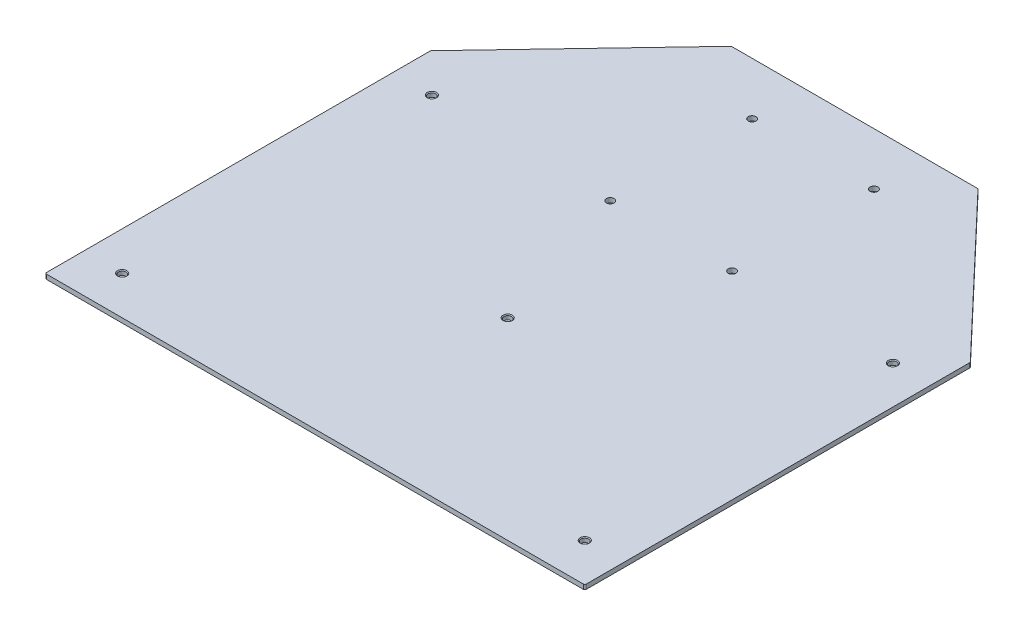
ISO-10303-21;
HEADER;
FILE_DESCRIPTION(('STEP AP214'),'2;1');
FILE_NAME('part.step','',(''),(''),'','','');
FILE_SCHEMA(('AUTOMOTIVE_DESIGN { 1 0 10303 214 1 1 1 1 }'));
ENDSEC;
DATA;
#1=APPLICATION_CONTEXT('core data for automotive mechanical design processes');
#2=APPLICATION_PROTOCOL_DEFINITION('international standard','automotive_design',2000,#1);
#3=PRODUCT_CONTEXT('',#1,'mechanical');
#4=PRODUCT('Part','Part','',(#3));
#5=PRODUCT_RELATED_PRODUCT_CATEGORY('part','',(#4));
#6=PRODUCT_DEFINITION_FORMATION('','',#4);
#7=PRODUCT_DEFINITION_CONTEXT('part definition',#1,'design');
#8=PRODUCT_DEFINITION('design','',#6,#7);
#9=PRODUCT_DEFINITION_SHAPE('','',#8);
#10=(LENGTH_UNIT() NAMED_UNIT(*) SI_UNIT(.MILLI.,.METRE.));
#11=(NAMED_UNIT(*) PLANE_ANGLE_UNIT() SI_UNIT($,.RADIAN.));
#12=(NAMED_UNIT(*) SI_UNIT($,.STERADIAN.) SOLID_ANGLE_UNIT());
#13=UNCERTAINTY_MEASURE_WITH_UNIT(LENGTH_MEASURE(1.E-05),#10,'distance_accuracy_value','');
#14=(GEOMETRIC_REPRESENTATION_CONTEXT(3) GLOBAL_UNCERTAINTY_ASSIGNED_CONTEXT((#13)) GLOBAL_UNIT_ASSIGNED_CONTEXT((#10,
#11,#12)) REPRESENTATION_CONTEXT('',''));
#15=CARTESIAN_POINT('',(0.,0.,0.));
#16=DIRECTION('',(0.,0.,1.));
#17=DIRECTION('',(1.,0.,0.));
#18=AXIS2_PLACEMENT_3D('',#15,#16,#17);
#19=CARTESIAN_POINT('',(-174.,3.,-124.600736952658));
#20=DIRECTION('',(0.,-1.,0.));
#21=DIRECTION('',(0.,0.,-1.));
#22=AXIS2_PLACEMENT_3D('',#19,#20,#21);
#23=CYLINDRICAL_SURFACE('',#22,0.999999999999998);
#24=CARTESIAN_POINT('',(-174.,0.,-124.600736952658));
#25=DIRECTION('',(0.,1.,0.));
#26=DIRECTION('',(0.,0.,1.));
#27=AXIS2_PLACEMENT_3D('',#24,#25,#26);
#28=CIRCLE('',#27,0.999999999999998);
#29=CARTESIAN_POINT('',(-174.725013849983,0.,-125.289471239109));
#30=VERTEX_POINT('',#29);
#31=CARTESIAN_POINT('',(-175.,0.,-124.600736952658));
#32=VERTEX_POINT('',#31);
#33=EDGE_CURVE('E168',#30,#32,#28,.T.);
#34=ORIENTED_EDGE('',*,*,#33,.T.);
#35=DIRECTION('',(0.,-1.,0.));
#36=VECTOR('',#35,1.);
#37=CARTESIAN_POINT('',(-175.,3.,-124.600736952658));
#38=LINE('',#37,#36);
#39=CARTESIAN_POINT('',(-175.,3.,-124.600736952658));
#40=VERTEX_POINT('',#39);
#41=EDGE_CURVE('E11',#40,#32,#38,.T.);
#42=ORIENTED_EDGE('',*,*,#41,.F.);
#43=CARTESIAN_POINT('',(-174.,3.,-124.600736952658));
#44=DIRECTION('',(0.,1.,0.));
#45=DIRECTION('',(0.,0.,1.));
#46=AXIS2_PLACEMENT_3D('',#43,#44,#45);
#47=CIRCLE('',#46,0.999999999999998);
#48=CARTESIAN_POINT('',(-174.725013849983,3.,-125.289471239109));
#49=VERTEX_POINT('',#48);
#50=EDGE_CURVE('E199',#49,#40,#47,.T.);
#51=ORIENTED_EDGE('',*,*,#50,.F.);
#52=DIRECTION('',(0.,-1.,0.));
#53=VECTOR('',#52,1.);
#54=CARTESIAN_POINT('',(-174.725013849983,3.,-125.289471239109));
#55=LINE('',#54,#53);
#56=EDGE_CURVE('E61',#49,#30,#55,.T.);
#57=ORIENTED_EDGE('',*,*,#56,.T.);
#58=EDGE_LOOP('',(#34,#42,#51,#57));
#59=FACE_BOUND('',#58,.T.);
#60=ADVANCED_FACE('F43',(#59),#23,.T.);
#61=CARTESIAN_POINT('',(-175.,3.,-124.600736952658));
#62=DIRECTION('',(1.,0.,0.));
#63=DIRECTION('',(0.,0.,-1.));
#64=AXIS2_PLACEMENT_3D('',#61,#62,#63);
#65=PLANE('',#64);
#66=DIRECTION('',(0.,0.,1.));
#67=VECTOR('',#66,1.);
#68=CARTESIAN_POINT('',(-175.,0.,-124.600736952658));
#69=LINE('',#68,#67);
#70=CARTESIAN_POINT('',(-175.,0.,124.));
#71=VERTEX_POINT('',#70);
#72=EDGE_CURVE('E170',#32,#71,#69,.T.);
#73=ORIENTED_EDGE('',*,*,#72,.T.);
#74=DIRECTION('',(0.,-1.,0.));
#75=VECTOR('',#74,1.);
#76=CARTESIAN_POINT('',(-175.,3.,124.));
#77=LINE('',#76,#75);
#78=CARTESIAN_POINT('',(-175.,3.,124.));
#79=VERTEX_POINT('',#78);
#80=EDGE_CURVE('E52',#79,#71,#77,.T.);
#81=ORIENTED_EDGE('',*,*,#80,.F.);
#82=DIRECTION('',(0.,0.,1.));
#83=VECTOR('',#82,1.);
#84=CARTESIAN_POINT('',(-175.,3.,-124.600736952658));
#85=LINE('',#84,#83);
#86=EDGE_CURVE('E112',#40,#79,#85,.T.);
#87=ORIENTED_EDGE('',*,*,#86,.F.);
#88=ORIENTED_EDGE('',*,*,#41,.T.);
#89=EDGE_LOOP('',(#73,#81,#87,#88));
#90=FACE_BOUND('',#89,.T.);
#91=ADVANCED_FACE('F332',(#90),#65,.F.);
#92=CARTESIAN_POINT('',(-174.,3.,124.));
#93=DIRECTION('',(0.,-1.,0.));
#94=DIRECTION('',(0.,0.,-1.));
#95=AXIS2_PLACEMENT_3D('',#92,#93,#94);
#96=CYLINDRICAL_SURFACE('',#95,1.);
#97=CARTESIAN_POINT('',(-174.,0.,124.));
#98=DIRECTION('',(0.,1.,0.));
#99=DIRECTION('',(0.,0.,1.));
#100=AXIS2_PLACEMENT_3D('',#97,#98,#99);
#101=CIRCLE('',#100,1.);
#102=CARTESIAN_POINT('',(-174.,0.,125.));
#103=VERTEX_POINT('',#102);
#104=EDGE_CURVE('E173',#71,#103,#101,.T.);
#105=ORIENTED_EDGE('',*,*,#104,.T.);
#106=DIRECTION('',(0.,-1.,0.));
#107=VECTOR('',#106,1.);
#108=CARTESIAN_POINT('',(-174.,3.,125.));
#109=LINE('',#108,#107);
#110=CARTESIAN_POINT('',(-174.,3.,125.));
#111=VERTEX_POINT('',#110);
#112=EDGE_CURVE('E213',#111,#103,#109,.T.);
#113=ORIENTED_EDGE('',*,*,#112,.F.);
#114=CARTESIAN_POINT('',(-174.,3.,124.));
#115=DIRECTION('',(0.,1.,0.));
#116=DIRECTION('',(0.,0.,1.));
#117=AXIS2_PLACEMENT_3D('',#114,#115,#116);
#118=CIRCLE('',#117,1.);
#119=EDGE_CURVE('E295',#79,#111,#118,.T.);
#120=ORIENTED_EDGE('',*,*,#119,.F.);
#121=ORIENTED_EDGE('',*,*,#80,.T.);
#122=EDGE_LOOP('',(#105,#113,#120,#121));
#123=FACE_BOUND('',#122,.T.);
#124=ADVANCED_FACE('F336',(#123),#96,.T.);
#125=CARTESIAN_POINT('',(-174.,3.,125.));
#126=DIRECTION('',(0.,0.,-1.));
#127=DIRECTION('',(-1.,0.,0.));
#128=AXIS2_PLACEMENT_3D('',#125,#126,#127);
#129=PLANE('',#128);
#130=DIRECTION('',(1.,0.,0.));
#131=VECTOR('',#130,1.);
#132=CARTESIAN_POINT('',(-174.,0.,125.));
#133=LINE('',#132,#131);
#134=CARTESIAN_POINT('',(174.,0.,125.));
#135=VERTEX_POINT('',#134);
#136=EDGE_CURVE('E175',#103,#135,#133,.T.);
#137=ORIENTED_EDGE('',*,*,#136,.T.);
#138=DIRECTION('',(0.,-1.,0.));
#139=VECTOR('',#138,1.);
#140=CARTESIAN_POINT('',(174.,3.,125.));
#141=LINE('',#140,#139);
#142=CARTESIAN_POINT('',(174.,3.,125.));
#143=VERTEX_POINT('',#142);
#144=EDGE_CURVE('E211',#143,#135,#141,.T.);
#145=ORIENTED_EDGE('',*,*,#144,.F.);
#146=DIRECTION('',(1.,0.,0.));
#147=VECTOR('',#146,1.);
#148=CARTESIAN_POINT('',(-174.,3.,125.));
#149=LINE('',#148,#147);
#150=EDGE_CURVE('E297',#111,#143,#149,.T.);
#151=ORIENTED_EDGE('',*,*,#150,.F.);
#152=ORIENTED_EDGE('',*,*,#112,.T.);
#153=EDGE_LOOP('',(#137,#145,#151,#152));
#154=FACE_BOUND('',#153,.T.);
#155=ADVANCED_FACE('F346',(#154),#129,.F.);
#156=CARTESIAN_POINT('',(174.,3.,124.));
#157=DIRECTION('',(0.,-1.,0.));
#158=DIRECTION('',(0.,0.,-1.));
#159=AXIS2_PLACEMENT_3D('',#156,#157,#158);
#160=CYLINDRICAL_SURFACE('',#159,1.);
#161=CARTESIAN_POINT('',(174.,0.,124.));
#162=DIRECTION('',(0.,-1.,0.));
#163=DIRECTION('',(0.,0.,-1.));
#164=AXIS2_PLACEMENT_3D('',#161,#162,#163);
#165=CIRCLE('',#164,1.);
#166=CARTESIAN_POINT('',(175.,0.,124.));
#167=VERTEX_POINT('',#166);
#168=EDGE_CURVE('E178',#167,#135,#165,.T.);
#169=ORIENTED_EDGE('',*,*,#168,.F.);
#170=DIRECTION('',(0.,-1.,0.));
#171=VECTOR('',#170,1.);
#172=CARTESIAN_POINT('',(175.,3.,124.));
#173=LINE('',#172,#171);
#174=CARTESIAN_POINT('',(175.,3.,124.));
#175=VERTEX_POINT('',#174);
#176=EDGE_CURVE('E209',#175,#167,#173,.T.);
#177=ORIENTED_EDGE('',*,*,#176,.F.);
#178=CARTESIAN_POINT('',(174.,3.,124.));
#179=DIRECTION('',(0.,-1.,0.));
#180=DIRECTION('',(0.,0.,-1.));
#181=AXIS2_PLACEMENT_3D('',#178,#179,#180);
#182=CIRCLE('',#181,1.);
#183=EDGE_CURVE('E299',#175,#143,#182,.T.);
#184=ORIENTED_EDGE('',*,*,#183,.T.);
#185=ORIENTED_EDGE('',*,*,#144,.T.);
#186=EDGE_LOOP('',(#169,#177,#184,#185));
#187=FACE_BOUND('',#186,.T.);
#188=ADVANCED_FACE('F362',(#187),#160,.T.);
#189=CARTESIAN_POINT('',(175.,3.,-124.600736952658));
#190=DIRECTION('',(1.,0.,0.));
#191=DIRECTION('',(0.,0.,-1.));
#192=AXIS2_PLACEMENT_3D('',#189,#190,#191);
#193=PLANE('',#192);
#194=DIRECTION('',(0.,0.,1.));
#195=VECTOR('',#194,1.);
#196=CARTESIAN_POINT('',(175.,0.,-124.600736952658));
#197=LINE('',#196,#195);
#198=CARTESIAN_POINT('',(175.,0.,-124.600736952658));
#199=VERTEX_POINT('',#198);
#200=EDGE_CURVE('E181',#199,#167,#197,.T.);
#201=ORIENTED_EDGE('',*,*,#200,.F.);
#202=DIRECTION('',(0.,-1.,0.));
#203=VECTOR('',#202,1.);
#204=CARTESIAN_POINT('',(175.,3.,-124.600736952658));
#205=LINE('',#204,#203);
#206=CARTESIAN_POINT('',(175.,3.,-124.600736952658));
#207=VERTEX_POINT('',#206);
#208=EDGE_CURVE('E207',#207,#199,#205,.T.);
#209=ORIENTED_EDGE('',*,*,#208,.F.);
#210=DIRECTION('',(0.,0.,1.));
#211=VECTOR('',#210,1.);
#212=CARTESIAN_POINT('',(175.,3.,-124.600736952658));
#213=LINE('',#212,#211);
#214=EDGE_CURVE('E302',#207,#175,#213,.T.);
#215=ORIENTED_EDGE('',*,*,#214,.T.);
#216=ORIENTED_EDGE('',*,*,#176,.T.);
#217=EDGE_LOOP('',(#201,#209,#215,#216));
#218=FACE_BOUND('',#217,.T.);
#219=ADVANCED_FACE('F352',(#218),#193,.T.);
#220=CARTESIAN_POINT('',(174.,3.,-124.600736952658));
#221=DIRECTION('',(0.,-1.,0.));
#222=DIRECTION('',(0.,0.,-1.));
#223=AXIS2_PLACEMENT_3D('',#220,#221,#222);
#224=CYLINDRICAL_SURFACE('',#223,0.999999999999998);
#225=CARTESIAN_POINT('',(174.,0.,-124.600736952658));
#226=DIRECTION('',(0.,-1.,0.));
#227=DIRECTION('',(0.,0.,-1.));
#228=AXIS2_PLACEMENT_3D('',#225,#226,#227);
#229=CIRCLE('',#228,0.999999999999998);
#230=CARTESIAN_POINT('',(174.725013849983,0.,-125.289471239109));
#231=VERTEX_POINT('',#230);
#232=EDGE_CURVE('E184',#231,#199,#229,.T.);
#233=ORIENTED_EDGE('',*,*,#232,.F.);
#234=DIRECTION('',(0.,-1.,0.));
#235=VECTOR('',#234,1.);
#236=CARTESIAN_POINT('',(174.725013849983,3.,-125.289471239109));
#237=LINE('',#236,#235);
#238=CARTESIAN_POINT('',(174.725013849983,3.,-125.289471239109));
#239=VERTEX_POINT('',#238);
#240=EDGE_CURVE('E205',#239,#231,#237,.T.);
#241=ORIENTED_EDGE('',*,*,#240,.F.);
#242=CARTESIAN_POINT('',(174.,3.,-124.600736952658));
#243=DIRECTION('',(0.,-1.,0.));
#244=DIRECTION('',(0.,0.,-1.));
#245=AXIS2_PLACEMENT_3D('',#242,#243,#244);
#246=CIRCLE('',#245,0.999999999999998);
#247=EDGE_CURVE('E305',#239,#207,#246,.T.);
#248=ORIENTED_EDGE('',*,*,#247,.T.);
#249=ORIENTED_EDGE('',*,*,#208,.T.);
#250=EDGE_LOOP('',(#233,#241,#248,#249));
#251=FACE_BOUND('',#250,.T.);
#252=ADVANCED_FACE('F354',(#251),#224,.T.);
#253=CARTESIAN_POINT('',(80.2956900328497,3.,-224.692926183626));
#254=DIRECTION('',(0.725013849983001,0.,-0.688734286450752));
#255=DIRECTION('',(-0.688734286450752,0.,-0.725013849983001));
#256=AXIS2_PLACEMENT_3D('',#253,#254,#255);
#257=PLANE('',#256);
#258=DIRECTION('',(0.688734286450752,0.,0.725013849983001));
#259=VECTOR('',#258,1.);
#260=CARTESIAN_POINT('',(80.2956900328497,0.,-224.692926183626));
#261=LINE('',#260,#259);
#262=CARTESIAN_POINT('',(80.2956900328497,0.,-224.692926183626));
#263=VERTEX_POINT('',#262);
#264=EDGE_CURVE('E187',#263,#231,#261,.T.);
#265=ORIENTED_EDGE('',*,*,#264,.F.);
#266=DIRECTION('',(0.,-1.,0.));
#267=VECTOR('',#266,1.);
#268=CARTESIAN_POINT('',(80.2956900328497,3.,-224.692926183626));
#269=LINE('',#268,#267);
#270=CARTESIAN_POINT('',(80.2956900328497,3.,-224.692926183626));
#271=VERTEX_POINT('',#270);
#272=EDGE_CURVE('E203',#271,#263,#269,.T.);
#273=ORIENTED_EDGE('',*,*,#272,.F.);
#274=DIRECTION('',(0.688734286450752,0.,0.725013849983001));
#275=VECTOR('',#274,1.);
#276=CARTESIAN_POINT('',(80.2956900328497,3.,-224.692926183626));
#277=LINE('',#276,#275);
#278=EDGE_CURVE('E163',#271,#239,#277,.T.);
#279=ORIENTED_EDGE('',*,*,#278,.T.);
#280=ORIENTED_EDGE('',*,*,#240,.T.);
#281=EDGE_LOOP('',(#265,#273,#279,#280));
#282=FACE_BOUND('',#281,.T.);
#283=ADVANCED_FACE('F310',(#282),#257,.T.);
#284=CARTESIAN_POINT('',(79.5706761828666,3.,-224.004191897175));
#285=DIRECTION('',(0.,-1.,0.));
#286=DIRECTION('',(0.,0.,-1.));
#287=AXIS2_PLACEMENT_3D('',#284,#285,#286);
#288=CYLINDRICAL_SURFACE('',#287,1.);
#289=CARTESIAN_POINT('',(79.5706761828666,0.,-224.004191897175));
#290=DIRECTION('',(0.,-1.,0.));
#291=DIRECTION('',(0.,0.,-1.));
#292=AXIS2_PLACEMENT_3D('',#289,#290,#291);
#293=CIRCLE('',#292,1.);
#294=CARTESIAN_POINT('',(79.5706761828666,0.,-225.004191897175));
#295=VERTEX_POINT('',#294);
#296=EDGE_CURVE('E190',#295,#263,#293,.T.);
#297=ORIENTED_EDGE('',*,*,#296,.F.);
#298=DIRECTION('',(0.,-1.,0.));
#299=VECTOR('',#298,1.);
#300=CARTESIAN_POINT('',(79.5706761828666,3.,-225.004191897175));
#301=LINE('',#300,#299);
#302=CARTESIAN_POINT('',(79.5706761828666,3.,-225.004191897175));
#303=VERTEX_POINT('',#302);
#304=EDGE_CURVE('E149',#303,#295,#301,.T.);
#305=ORIENTED_EDGE('',*,*,#304,.F.);
#306=CARTESIAN_POINT('',(79.5706761828666,3.,-224.004191897175));
#307=DIRECTION('',(0.,-1.,0.));
#308=DIRECTION('',(0.,0.,-1.));
#309=AXIS2_PLACEMENT_3D('',#306,#307,#308);
#310=CIRCLE('',#309,1.);
#311=EDGE_CURVE('E161',#303,#271,#310,.T.);
#312=ORIENTED_EDGE('',*,*,#311,.T.);
#313=ORIENTED_EDGE('',*,*,#272,.T.);
#314=EDGE_LOOP('',(#297,#305,#312,#313));
#315=FACE_BOUND('',#314,.T.);
#316=ADVANCED_FACE('F316',(#315),#288,.T.);
#317=CARTESIAN_POINT('',(-79.5706761828666,3.,-225.004191897175));
#318=DIRECTION('',(0.,0.,-1.));
#319=DIRECTION('',(-1.,0.,0.));
#320=AXIS2_PLACEMENT_3D('',#317,#318,#319);
#321=PLANE('',#320);
#322=DIRECTION('',(1.,0.,0.));
#323=VECTOR('',#322,1.);
#324=CARTESIAN_POINT('',(-79.5706761828666,0.,-225.004191897175));
#325=LINE('',#324,#323);
#326=CARTESIAN_POINT('',(-79.5706761828666,0.,-225.004191897175));
#327=VERTEX_POINT('',#326);
#328=EDGE_CURVE('E146',#327,#295,#325,.T.);
#329=ORIENTED_EDGE('',*,*,#328,.F.);
#330=DIRECTION('',(0.,-1.,0.));
#331=VECTOR('',#330,1.);
#332=CARTESIAN_POINT('',(-79.5706761828666,3.,-225.004191897175));
#333=LINE('',#332,#331);
#334=CARTESIAN_POINT('',(-79.5706761828666,3.,-225.004191897175));
#335=VERTEX_POINT('',#334);
#336=EDGE_CURVE('E140',#335,#327,#333,.T.);
#337=ORIENTED_EDGE('',*,*,#336,.F.);
#338=DIRECTION('',(1.,0.,0.));
#339=VECTOR('',#338,1.);
#340=CARTESIAN_POINT('',(-79.5706761828666,3.,-225.004191897175));
#341=LINE('',#340,#339);
#342=EDGE_CURVE('E144',#335,#303,#341,.T.);
#343=ORIENTED_EDGE('',*,*,#342,.T.);
#344=ORIENTED_EDGE('',*,*,#304,.T.);
#345=EDGE_LOOP('',(#329,#337,#343,#344));
#346=FACE_BOUND('',#345,.T.);
#347=ADVANCED_FACE('F142',(#346),#321,.T.);
#348=CARTESIAN_POINT('',(-79.5706761828666,3.,-224.004191897175));
#349=DIRECTION('',(0.,-1.,0.));
#350=DIRECTION('',(0.,0.,-1.));
#351=AXIS2_PLACEMENT_3D('',#348,#349,#350);
#352=CYLINDRICAL_SURFACE('',#351,1.);
#353=CARTESIAN_POINT('',(-79.5706761828666,0.,-224.004191897175));
#354=DIRECTION('',(0.,1.,0.));
#355=DIRECTION('',(0.,0.,1.));
#356=AXIS2_PLACEMENT_3D('',#353,#354,#355);
#357=CIRCLE('',#356,1.);
#358=CARTESIAN_POINT('',(-80.2956900328497,0.,-224.692926183626));
#359=VERTEX_POINT('',#358);
#360=EDGE_CURVE('E194',#327,#359,#357,.T.);
#361=ORIENTED_EDGE('',*,*,#360,.T.);
#362=DIRECTION('',(0.,-1.,0.));
#363=VECTOR('',#362,1.);
#364=CARTESIAN_POINT('',(-80.2956900328497,3.,-224.692926183626));
#365=LINE('',#364,#363);
#366=CARTESIAN_POINT('',(-80.2956900328497,3.,-224.692926183626));
#367=VERTEX_POINT('',#366);
#368=EDGE_CURVE('E100',#367,#359,#365,.T.);
#369=ORIENTED_EDGE('',*,*,#368,.F.);
#370=CARTESIAN_POINT('',(-79.5706761828666,3.,-224.004191897175));
#371=DIRECTION('',(0.,1.,0.));
#372=DIRECTION('',(0.,0.,1.));
#373=AXIS2_PLACEMENT_3D('',#370,#371,#372);
#374=CIRCLE('',#373,1.);
#375=EDGE_CURVE('E151',#335,#367,#374,.T.);
#376=ORIENTED_EDGE('',*,*,#375,.F.);
#377=ORIENTED_EDGE('',*,*,#336,.T.);
#378=EDGE_LOOP('',(#361,#369,#376,#377));
#379=FACE_BOUND('',#378,.T.);
#380=ADVANCED_FACE('F152',(#379),#352,.T.);
#381=CARTESIAN_POINT('',(-174.725013849983,3.,-125.289471239109));
#382=DIRECTION('',(-0.725013849983,0.,-0.688734286450753));
#383=DIRECTION('',(-0.688734286450753,0.,0.725013849983));
#384=AXIS2_PLACEMENT_3D('',#381,#382,#383);
#385=PLANE('',#384);
#386=DIRECTION('',(0.688734286450752,0.,-0.725013849983));
#387=VECTOR('',#386,1.);
#388=CARTESIAN_POINT('',(-174.725013849983,0.,-125.289471239109));
#389=LINE('',#388,#387);
#390=EDGE_CURVE('E196',#30,#359,#389,.T.);
#391=ORIENTED_EDGE('',*,*,#390,.F.);
#392=ORIENTED_EDGE('',*,*,#56,.F.);
#393=DIRECTION('',(0.688734286450752,0.,-0.725013849983));
#394=VECTOR('',#393,1.);
#395=CARTESIAN_POINT('',(-174.725013849983,3.,-125.289471239109));
#396=LINE('',#395,#394);
#397=EDGE_CURVE('E155',#49,#367,#396,.T.);
#398=ORIENTED_EDGE('',*,*,#397,.T.);
#399=ORIENTED_EDGE('',*,*,#368,.T.);
#400=EDGE_LOOP('',(#391,#392,#398,#399));
#401=FACE_BOUND('',#400,.T.);
#402=ADVANCED_FACE('F319',(#401),#385,.T.);
#403=CARTESIAN_POINT('',(-174.,3.,-124.600736952658));
#404=DIRECTION('',(0.,1.,0.));
#405=DIRECTION('',(0.,0.,1.));
#406=AXIS2_PLACEMENT_3D('',#403,#404,#405);
#407=PLANE('',#406);
#408=CARTESIAN_POINT('',(46.5,3.,-191.004191906175));
#409=DIRECTION('',(0.,1.,0.));
#410=DIRECTION('',(0.,0.,1.));
#411=AXIS2_PLACEMENT_3D('',#408,#409,#410);
#412=CIRCLE('',#411,2.49999999999999);
#413=CARTESIAN_POINT('',(46.5,3.,-188.504191906175));
#414=VERTEX_POINT('',#413);
#415=EDGE_CURVE('E46',#414,#414,#412,.T.);
#416=ORIENTED_EDGE('',*,*,#415,.F.);
#417=EDGE_LOOP('',(#416));
#418=FACE_BOUND('',#417,.T.);
#419=CARTESIAN_POINT('',(-32.5,3.,-191.004191906175));
#420=DIRECTION('',(0.,1.,0.));
#421=DIRECTION('',(0.,0.,1.));
#422=AXIS2_PLACEMENT_3D('',#419,#420,#421);
#423=CIRCLE('',#422,2.49999999999999);
#424=CARTESIAN_POINT('',(-32.5,3.,-188.504191906175));
#425=VERTEX_POINT('',#424);
#426=EDGE_CURVE('E227',#425,#425,#423,.T.);
#427=ORIENTED_EDGE('',*,*,#426,.F.);
#428=EDGE_LOOP('',(#427));
#429=FACE_BOUND('',#428,.T.);
#430=CARTESIAN_POINT('',(-32.5,3.,-99.0041918971752));
#431=DIRECTION('',(0.,1.,0.));
#432=DIRECTION('',(0.,0.,1.));
#433=AXIS2_PLACEMENT_3D('',#430,#431,#432);
#434=CIRCLE('',#433,2.49999999999999);
#435=CARTESIAN_POINT('',(-32.5,3.,-96.5041918971752));
#436=VERTEX_POINT('',#435);
#437=EDGE_CURVE('E223',#436,#436,#434,.T.);
#438=ORIENTED_EDGE('',*,*,#437,.F.);
#439=EDGE_LOOP('',(#438));
#440=FACE_BOUND('',#439,.T.);
#441=CARTESIAN_POINT('',(46.5,3.,-99.0041918971752));
#442=DIRECTION('',(0.,1.,0.));
#443=DIRECTION('',(0.,0.,1.));
#444=AXIS2_PLACEMENT_3D('',#441,#442,#443);
#445=CIRCLE('',#444,2.49999999999999);
#446=CARTESIAN_POINT('',(46.5,3.,-96.5041918971752));
#447=VERTEX_POINT('',#446);
#448=EDGE_CURVE('E218',#447,#447,#445,.T.);
#449=ORIENTED_EDGE('',*,*,#448,.F.);
#450=EDGE_LOOP('',(#449));
#451=FACE_BOUND('',#450,.T.);
#452=CARTESIAN_POINT('',(-150.,3.,100.));
#453=DIRECTION('',(0.,1.,0.));
#454=DIRECTION('',(0.,0.,1.));
#455=AXIS2_PLACEMENT_3D('',#452,#453,#454);
#456=CIRCLE('',#455,3.025);
#457=CARTESIAN_POINT('',(-150.,3.,103.025));
#458=VERTEX_POINT('',#457);
#459=EDGE_CURVE('E221',#458,#458,#456,.T.);
#460=ORIENTED_EDGE('',*,*,#459,.F.);
#461=EDGE_LOOP('',(#460));
#462=FACE_BOUND('',#461,.T.);
#463=CARTESIAN_POINT('',(150.,3.,100.));
#464=DIRECTION('',(0.,1.,0.));
#465=DIRECTION('',(0.,0.,1.));
#466=AXIS2_PLACEMENT_3D('',#463,#464,#465);
#467=CIRCLE('',#466,3.025);
#468=CARTESIAN_POINT('',(150.,3.,103.025));
#469=VERTEX_POINT('',#468);
#470=EDGE_CURVE('E258',#469,#469,#467,.T.);
#471=ORIENTED_EDGE('',*,*,#470,.F.);
#472=EDGE_LOOP('',(#471));
#473=FACE_BOUND('',#472,.T.);
#474=CARTESIAN_POINT('',(0.,3.,0.));
#475=DIRECTION('',(0.,1.,0.));
#476=DIRECTION('',(0.,0.,1.));
#477=AXIS2_PLACEMENT_3D('',#474,#475,#476);
#478=CIRCLE('',#477,3.025);
#479=CARTESIAN_POINT('',(0.,3.,3.025));
#480=VERTEX_POINT('',#479);
#481=EDGE_CURVE('E267',#480,#480,#478,.T.);
#482=ORIENTED_EDGE('',*,*,#481,.F.);
#483=EDGE_LOOP('',(#482));
#484=FACE_BOUND('',#483,.T.);
#485=CARTESIAN_POINT('',(-149.655838955515,3.,-100.514326672973));
#486=DIRECTION('',(0.,1.,0.));
#487=DIRECTION('',(0.,0.,1.));
#488=AXIS2_PLACEMENT_3D('',#485,#486,#487);
#489=CIRCLE('',#488,3.025);
#490=CARTESIAN_POINT('',(-149.655838955515,3.,-97.4893266729726));
#491=VERTEX_POINT('',#490);
#492=EDGE_CURVE('E276',#491,#491,#489,.T.);
#493=ORIENTED_EDGE('',*,*,#492,.F.);
#494=EDGE_LOOP('',(#493));
#495=FACE_BOUND('',#494,.T.);
#496=CARTESIAN_POINT('',(150.34239345025,3.,-99.4844949308703));
#497=DIRECTION('',(0.,1.,0.));
#498=DIRECTION('',(0.,0.,1.));
#499=AXIS2_PLACEMENT_3D('',#496,#497,#498);
#500=CIRCLE('',#499,3.025);
#501=CARTESIAN_POINT('',(150.34239345025,3.,-96.4594949308702));
#502=VERTEX_POINT('',#501);
#503=EDGE_CURVE('E285',#502,#502,#500,.T.);
#504=ORIENTED_EDGE('',*,*,#503,.F.);
#505=EDGE_LOOP('',(#504));
#506=FACE_BOUND('',#505,.T.);
#507=ORIENTED_EDGE('',*,*,#50,.T.);
#508=ORIENTED_EDGE('',*,*,#86,.T.);
#509=ORIENTED_EDGE('',*,*,#119,.T.);
#510=ORIENTED_EDGE('',*,*,#150,.T.);
#511=ORIENTED_EDGE('',*,*,#183,.F.);
#512=ORIENTED_EDGE('',*,*,#214,.F.);
#513=ORIENTED_EDGE('',*,*,#247,.F.);
#514=ORIENTED_EDGE('',*,*,#278,.F.);
#515=ORIENTED_EDGE('',*,*,#311,.F.);
#516=ORIENTED_EDGE('',*,*,#342,.F.);
#517=ORIENTED_EDGE('',*,*,#375,.T.);
#518=ORIENTED_EDGE('',*,*,#397,.F.);
#519=EDGE_LOOP('',(#507,#508,#509,#510,#511,#512,#513,#514,#515,#516,#517,#518));
#520=FACE_BOUND('',#519,.T.);
#521=ADVANCED_FACE('F158',(#418,#429,#440,#451,#462,#473,#484,#495,#506,#520),#407,.T.);
#522=CARTESIAN_POINT('',(-174.,0.,-124.600736952658));
#523=DIRECTION('',(0.,1.,0.));
#524=DIRECTION('',(0.,0.,1.));
#525=AXIS2_PLACEMENT_3D('',#522,#523,#524);
#526=PLANE('',#525);
#527=CARTESIAN_POINT('',(46.5,0.,-191.004191906175));
#528=DIRECTION('',(0.,-1.,0.));
#529=DIRECTION('',(0.,0.,-1.));
#530=AXIS2_PLACEMENT_3D('',#527,#528,#529);
#531=CIRCLE('',#530,2.525);
#532=CARTESIAN_POINT('',(46.5,0.,-193.529191906175));
#533=VERTEX_POINT('',#532);
#534=EDGE_CURVE('E655',#533,#533,#531,.T.);
#535=ORIENTED_EDGE('',*,*,#534,.F.);
#536=EDGE_LOOP('',(#535));
#537=FACE_BOUND('',#536,.T.);
#538=CARTESIAN_POINT('',(-32.5,0.,-191.004191906175));
#539=DIRECTION('',(0.,-1.,0.));
#540=DIRECTION('',(0.,0.,-1.));
#541=AXIS2_PLACEMENT_3D('',#538,#539,#540);
#542=CIRCLE('',#541,2.525);
#543=CARTESIAN_POINT('',(-32.5,0.,-193.529191906175));
#544=VERTEX_POINT('',#543);
#545=EDGE_CURVE('E236',#544,#544,#542,.T.);
#546=ORIENTED_EDGE('',*,*,#545,.F.);
#547=EDGE_LOOP('',(#546));
#548=FACE_BOUND('',#547,.T.);
#549=CARTESIAN_POINT('',(-32.5,0.,-99.0041918971752));
#550=DIRECTION('',(0.,-1.,0.));
#551=DIRECTION('',(0.,0.,-1.));
#552=AXIS2_PLACEMENT_3D('',#549,#550,#551);
#553=CIRCLE('',#552,2.525);
#554=CARTESIAN_POINT('',(-32.5,0.,-101.529191897175));
#555=VERTEX_POINT('',#554);
#556=EDGE_CURVE('E229',#555,#555,#553,.T.);
#557=ORIENTED_EDGE('',*,*,#556,.F.);
#558=EDGE_LOOP('',(#557));
#559=FACE_BOUND('',#558,.T.);
#560=CARTESIAN_POINT('',(46.5,0.,-99.0041918971752));
#561=DIRECTION('',(0.,-1.,0.));
#562=DIRECTION('',(0.,0.,-1.));
#563=AXIS2_PLACEMENT_3D('',#560,#561,#562);
#564=CIRCLE('',#563,2.525);
#565=CARTESIAN_POINT('',(46.5,0.,-101.529191897175));
#566=VERTEX_POINT('',#565);
#567=EDGE_CURVE('E225',#566,#566,#564,.T.);
#568=ORIENTED_EDGE('',*,*,#567,.F.);
#569=EDGE_LOOP('',(#568));
#570=FACE_BOUND('',#569,.T.);
#571=CARTESIAN_POINT('',(-150.,0.,100.));
#572=DIRECTION('',(0.,1.,0.));
#573=DIRECTION('',(0.,0.,1.));
#574=AXIS2_PLACEMENT_3D('',#571,#572,#573);
#575=CIRCLE('',#574,2.5);
#576=CARTESIAN_POINT('',(-150.,0.,102.5));
#577=VERTEX_POINT('',#576);
#578=EDGE_CURVE('E255',#577,#577,#575,.T.);
#579=ORIENTED_EDGE('',*,*,#578,.T.);
#580=EDGE_LOOP('',(#579));
#581=FACE_BOUND('',#580,.T.);
#582=CARTESIAN_POINT('',(150.,0.,100.));
#583=DIRECTION('',(0.,1.,0.));
#584=DIRECTION('',(0.,0.,1.));
#585=AXIS2_PLACEMENT_3D('',#582,#583,#584);
#586=CIRCLE('',#585,2.5);
#587=CARTESIAN_POINT('',(150.,0.,102.5));
#588=VERTEX_POINT('',#587);
#589=EDGE_CURVE('E264',#588,#588,#586,.T.);
#590=ORIENTED_EDGE('',*,*,#589,.T.);
#591=EDGE_LOOP('',(#590));
#592=FACE_BOUND('',#591,.T.);
#593=CARTESIAN_POINT('',(0.,0.,0.));
#594=DIRECTION('',(0.,1.,0.));
#595=DIRECTION('',(0.,0.,1.));
#596=AXIS2_PLACEMENT_3D('',#593,#594,#595);
#597=CIRCLE('',#596,2.5);
#598=CARTESIAN_POINT('',(0.,0.,2.5));
#599=VERTEX_POINT('',#598);
#600=EDGE_CURVE('E273',#599,#599,#597,.T.);
#601=ORIENTED_EDGE('',*,*,#600,.T.);
#602=EDGE_LOOP('',(#601));
#603=FACE_BOUND('',#602,.T.);
#604=CARTESIAN_POINT('',(-149.655838955515,0.,-100.514326672973));
#605=DIRECTION('',(0.,1.,0.));
#606=DIRECTION('',(0.,0.,1.));
#607=AXIS2_PLACEMENT_3D('',#604,#605,#606);
#608=CIRCLE('',#607,2.5);
#609=CARTESIAN_POINT('',(-149.655838955515,0.,-98.0143266729726));
#610=VERTEX_POINT('',#609);
#611=EDGE_CURVE('E282',#610,#610,#608,.T.);
#612=ORIENTED_EDGE('',*,*,#611,.T.);
#613=EDGE_LOOP('',(#612));
#614=FACE_BOUND('',#613,.T.);
#615=CARTESIAN_POINT('',(150.34239345025,0.,-99.4844949308703));
#616=DIRECTION('',(0.,1.,0.));
#617=DIRECTION('',(0.,0.,1.));
#618=AXIS2_PLACEMENT_3D('',#615,#616,#617);
#619=CIRCLE('',#618,2.5);
#620=CARTESIAN_POINT('',(150.34239345025,0.,-96.9844949308702));
#621=VERTEX_POINT('',#620);
#622=EDGE_CURVE('E171',#621,#621,#619,.T.);
#623=ORIENTED_EDGE('',*,*,#622,.T.);
#624=EDGE_LOOP('',(#623));
#625=FACE_BOUND('',#624,.T.);
#626=ORIENTED_EDGE('',*,*,#33,.F.);
#627=ORIENTED_EDGE('',*,*,#390,.T.);
#628=ORIENTED_EDGE('',*,*,#360,.F.);
#629=ORIENTED_EDGE('',*,*,#328,.T.);
#630=ORIENTED_EDGE('',*,*,#296,.T.);
#631=ORIENTED_EDGE('',*,*,#264,.T.);
#632=ORIENTED_EDGE('',*,*,#232,.T.);
#633=ORIENTED_EDGE('',*,*,#200,.T.);
#634=ORIENTED_EDGE('',*,*,#168,.T.);
#635=ORIENTED_EDGE('',*,*,#136,.F.);
#636=ORIENTED_EDGE('',*,*,#104,.F.);
#637=ORIENTED_EDGE('',*,*,#72,.F.);
#638=EDGE_LOOP('',(#626,#627,#628,#629,#630,#631,#632,#633,#634,#635,#636,#637));
#639=FACE_BOUND('',#638,.T.);
#640=ADVANCED_FACE('F318',(#537,#548,#559,#570,#581,#592,#603,#614,#625,#639),#526,.F.);
#641=CARTESIAN_POINT('',(150.34239345025,3.,-99.4844949308703));
#642=DIRECTION('',(0.,1.,0.));
#643=DIRECTION('',(0.,0.,1.));
#644=AXIS2_PLACEMENT_3D('',#641,#642,#643);
#645=CYLINDRICAL_SURFACE('',#644,2.5);
#646=ORIENTED_EDGE('',*,*,#622,.F.);
#647=EDGE_LOOP('',(#646));
#648=FACE_BOUND('',#647,.T.);
#649=CARTESIAN_POINT('',(150.34239345025,2.475,-99.4844949308703));
#650=DIRECTION('',(0.,1.,0.));
#651=DIRECTION('',(0.,0.,1.));
#652=AXIS2_PLACEMENT_3D('',#649,#650,#651);
#653=CIRCLE('',#652,2.5);
#654=CARTESIAN_POINT('',(150.34239345025,2.475,-96.9844949308702));
#655=VERTEX_POINT('',#654);
#656=EDGE_CURVE('E288',#655,#655,#653,.T.);
#657=ORIENTED_EDGE('',*,*,#656,.T.);
#658=EDGE_LOOP('',(#657));
#659=FACE_BOUND('',#658,.T.);
#660=ADVANCED_FACE('F428',(#648,#659),#645,.F.);
#661=CARTESIAN_POINT('',(150.34239345025,3.,-99.4844949308703));
#662=DIRECTION('',(0.,1.,0.));
#663=DIRECTION('',(0.,0.,1.));
#664=AXIS2_PLACEMENT_3D('',#661,#662,#663);
#665=CONICAL_SURFACE('',#664,3.025,0.785398163397446);
#666=ORIENTED_EDGE('',*,*,#656,.F.);
#667=EDGE_LOOP('',(#666));
#668=FACE_BOUND('',#667,.T.);
#669=ORIENTED_EDGE('',*,*,#503,.T.);
#670=EDGE_LOOP('',(#669));
#671=FACE_BOUND('',#670,.T.);
#672=ADVANCED_FACE('F434',(#668,#671),#665,.F.);
#673=CARTESIAN_POINT('',(-149.655838955515,3.,-100.514326672973));
#674=DIRECTION('',(0.,1.,0.));
#675=DIRECTION('',(0.,0.,1.));
#676=AXIS2_PLACEMENT_3D('',#673,#674,#675);
#677=CYLINDRICAL_SURFACE('',#676,2.5);
#678=ORIENTED_EDGE('',*,*,#611,.F.);
#679=EDGE_LOOP('',(#678));
#680=FACE_BOUND('',#679,.T.);
#681=CARTESIAN_POINT('',(-149.655838955515,2.475,-100.514326672973));
#682=DIRECTION('',(0.,1.,0.));
#683=DIRECTION('',(0.,0.,1.));
#684=AXIS2_PLACEMENT_3D('',#681,#682,#683);
#685=CIRCLE('',#684,2.5);
#686=CARTESIAN_POINT('',(-149.655838955515,2.475,-98.0143266729726));
#687=VERTEX_POINT('',#686);
#688=EDGE_CURVE('E279',#687,#687,#685,.T.);
#689=ORIENTED_EDGE('',*,*,#688,.T.);
#690=EDGE_LOOP('',(#689));
#691=FACE_BOUND('',#690,.T.);
#692=ADVANCED_FACE('F449',(#680,#691),#677,.F.);
#693=CARTESIAN_POINT('',(-149.655838955515,3.,-100.514326672973));
#694=DIRECTION('',(0.,1.,0.));
#695=DIRECTION('',(0.,0.,1.));
#696=AXIS2_PLACEMENT_3D('',#693,#694,#695);
#697=CONICAL_SURFACE('',#696,3.025,0.785398163397446);
#698=ORIENTED_EDGE('',*,*,#688,.F.);
#699=EDGE_LOOP('',(#698));
#700=FACE_BOUND('',#699,.T.);
#701=ORIENTED_EDGE('',*,*,#492,.T.);
#702=EDGE_LOOP('',(#701));
#703=FACE_BOUND('',#702,.T.);
#704=ADVANCED_FACE('F460',(#700,#703),#697,.F.);
#705=CARTESIAN_POINT('',(0.,3.,0.));
#706=DIRECTION('',(0.,1.,0.));
#707=DIRECTION('',(0.,0.,1.));
#708=AXIS2_PLACEMENT_3D('',#705,#706,#707);
#709=CYLINDRICAL_SURFACE('',#708,2.5);
#710=ORIENTED_EDGE('',*,*,#600,.F.);
#711=EDGE_LOOP('',(#710));
#712=FACE_BOUND('',#711,.T.);
#713=CARTESIAN_POINT('',(0.,2.475,0.));
#714=DIRECTION('',(0.,1.,0.));
#715=DIRECTION('',(0.,0.,1.));
#716=AXIS2_PLACEMENT_3D('',#713,#714,#715);
#717=CIRCLE('',#716,2.5);
#718=CARTESIAN_POINT('',(0.,2.475,2.5));
#719=VERTEX_POINT('',#718);
#720=EDGE_CURVE('E270',#719,#719,#717,.T.);
#721=ORIENTED_EDGE('',*,*,#720,.T.);
#722=EDGE_LOOP('',(#721));
#723=FACE_BOUND('',#722,.T.);
#724=ADVANCED_FACE('F472',(#712,#723),#709,.F.);
#725=CARTESIAN_POINT('',(0.,3.,0.));
#726=DIRECTION('',(0.,1.,0.));
#727=DIRECTION('',(0.,0.,1.));
#728=AXIS2_PLACEMENT_3D('',#725,#726,#727);
#729=CONICAL_SURFACE('',#728,3.025,0.785398163397448);
#730=ORIENTED_EDGE('',*,*,#720,.F.);
#731=EDGE_LOOP('',(#730));
#732=FACE_BOUND('',#731,.T.);
#733=ORIENTED_EDGE('',*,*,#481,.T.);
#734=EDGE_LOOP('',(#733));
#735=FACE_BOUND('',#734,.T.);
#736=ADVANCED_FACE('F483',(#732,#735),#729,.F.);
#737=CARTESIAN_POINT('',(150.,3.,100.));
#738=DIRECTION('',(0.,1.,0.));
#739=DIRECTION('',(0.,0.,1.));
#740=AXIS2_PLACEMENT_3D('',#737,#738,#739);
#741=CYLINDRICAL_SURFACE('',#740,2.5);
#742=ORIENTED_EDGE('',*,*,#589,.F.);
#743=EDGE_LOOP('',(#742));
#744=FACE_BOUND('',#743,.T.);
#745=CARTESIAN_POINT('',(150.,2.475,100.));
#746=DIRECTION('',(0.,1.,0.));
#747=DIRECTION('',(0.,0.,1.));
#748=AXIS2_PLACEMENT_3D('',#745,#746,#747);
#749=CIRCLE('',#748,2.5);
#750=CARTESIAN_POINT('',(150.,2.475,102.5));
#751=VERTEX_POINT('',#750);
#752=EDGE_CURVE('E261',#751,#751,#749,.T.);
#753=ORIENTED_EDGE('',*,*,#752,.T.);
#754=EDGE_LOOP('',(#753));
#755=FACE_BOUND('',#754,.T.);
#756=ADVANCED_FACE('F495',(#744,#755),#741,.F.);
#757=CARTESIAN_POINT('',(150.,3.,100.));
#758=DIRECTION('',(0.,1.,0.));
#759=DIRECTION('',(0.,0.,1.));
#760=AXIS2_PLACEMENT_3D('',#757,#758,#759);
#761=CONICAL_SURFACE('',#760,3.025,0.785398163397446);
#762=ORIENTED_EDGE('',*,*,#752,.F.);
#763=EDGE_LOOP('',(#762));
#764=FACE_BOUND('',#763,.T.);
#765=ORIENTED_EDGE('',*,*,#470,.T.);
#766=EDGE_LOOP('',(#765));
#767=FACE_BOUND('',#766,.T.);
#768=ADVANCED_FACE('F506',(#764,#767),#761,.F.);
#769=CARTESIAN_POINT('',(-150.,3.,100.));
#770=DIRECTION('',(0.,1.,0.));
#771=DIRECTION('',(0.,0.,1.));
#772=AXIS2_PLACEMENT_3D('',#769,#770,#771);
#773=CYLINDRICAL_SURFACE('',#772,2.5);
#774=ORIENTED_EDGE('',*,*,#578,.F.);
#775=EDGE_LOOP('',(#774));
#776=FACE_BOUND('',#775,.T.);
#777=CARTESIAN_POINT('',(-150.,2.475,100.));
#778=DIRECTION('',(0.,1.,0.));
#779=DIRECTION('',(0.,0.,1.));
#780=AXIS2_PLACEMENT_3D('',#777,#778,#779);
#781=CIRCLE('',#780,2.5);
#782=CARTESIAN_POINT('',(-150.,2.475,102.5));
#783=VERTEX_POINT('',#782);
#784=EDGE_CURVE('E252',#783,#783,#781,.T.);
#785=ORIENTED_EDGE('',*,*,#784,.T.);
#786=EDGE_LOOP('',(#785));
#787=FACE_BOUND('',#786,.T.);
#788=ADVANCED_FACE('F518',(#776,#787),#773,.F.);
#789=CARTESIAN_POINT('',(-150.,3.,100.));
#790=DIRECTION('',(0.,1.,0.));
#791=DIRECTION('',(0.,0.,1.));
#792=AXIS2_PLACEMENT_3D('',#789,#790,#791);
#793=CONICAL_SURFACE('',#792,3.025,0.785398163397446);
#794=ORIENTED_EDGE('',*,*,#784,.F.);
#795=EDGE_LOOP('',(#794));
#796=FACE_BOUND('',#795,.T.);
#797=ORIENTED_EDGE('',*,*,#459,.T.);
#798=EDGE_LOOP('',(#797));
#799=FACE_BOUND('',#798,.T.);
#800=ADVANCED_FACE('F529',(#796,#799),#793,.F.);
#801=CARTESIAN_POINT('',(46.5,0.,-99.0041918971752));
#802=DIRECTION('',(0.,-1.,0.));
#803=DIRECTION('',(0.,0.,-1.));
#804=AXIS2_PLACEMENT_3D('',#801,#802,#803);
#805=CYLINDRICAL_SURFACE('',#804,2.49999999999999);
#806=ORIENTED_EDGE('',*,*,#448,.T.);
#807=EDGE_LOOP('',(#806));
#808=FACE_BOUND('',#807,.T.);
#809=CARTESIAN_POINT('',(46.5,0.0250000000000111,-99.0041918971752));
#810=DIRECTION('',(0.,-1.,0.));
#811=DIRECTION('',(0.,0.,-1.));
#812=AXIS2_PLACEMENT_3D('',#809,#810,#811);
#813=CIRCLE('',#812,2.49999999999999);
#814=CARTESIAN_POINT('',(46.5,0.0250000000000111,-101.504191897175));
#815=VERTEX_POINT('',#814);
#816=EDGE_CURVE('E222',#815,#815,#813,.T.);
#817=ORIENTED_EDGE('',*,*,#816,.T.);
#818=EDGE_LOOP('',(#817));
#819=FACE_BOUND('',#818,.T.);
#820=ADVANCED_FACE('F540',(#808,#819),#805,.F.);
#821=CARTESIAN_POINT('',(46.5,0.,-99.0041918971752));
#822=DIRECTION('',(0.,-1.,0.));
#823=DIRECTION('',(0.,0.,-1.));
#824=AXIS2_PLACEMENT_3D('',#821,#822,#823);
#825=CONICAL_SURFACE('',#824,2.525,0.785398163397414);
#826=ORIENTED_EDGE('',*,*,#816,.F.);
#827=EDGE_LOOP('',(#826));
#828=FACE_BOUND('',#827,.T.);
#829=ORIENTED_EDGE('',*,*,#567,.T.);
#830=EDGE_LOOP('',(#829));
#831=FACE_BOUND('',#830,.T.);
#832=ADVANCED_FACE('F560',(#828,#831),#825,.F.);
#833=CARTESIAN_POINT('',(-32.5,0.,-99.0041918971752));
#834=DIRECTION('',(0.,-1.,0.));
#835=DIRECTION('',(0.,0.,-1.));
#836=AXIS2_PLACEMENT_3D('',#833,#834,#835);
#837=CYLINDRICAL_SURFACE('',#836,2.49999999999999);
#838=ORIENTED_EDGE('',*,*,#437,.T.);
#839=EDGE_LOOP('',(#838));
#840=FACE_BOUND('',#839,.T.);
#841=CARTESIAN_POINT('',(-32.5,0.0250000000000111,-99.0041918971752));
#842=DIRECTION('',(0.,-1.,0.));
#843=DIRECTION('',(0.,0.,-1.));
#844=AXIS2_PLACEMENT_3D('',#841,#842,#843);
#845=CIRCLE('',#844,2.49999999999999);
#846=CARTESIAN_POINT('',(-32.5,0.0250000000000111,-101.504191897175));
#847=VERTEX_POINT('',#846);
#848=EDGE_CURVE('E226',#847,#847,#845,.T.);
#849=ORIENTED_EDGE('',*,*,#848,.T.);
#850=EDGE_LOOP('',(#849));
#851=FACE_BOUND('',#850,.T.);
#852=ADVANCED_FACE('F571',(#840,#851),#837,.F.);
#853=CARTESIAN_POINT('',(-32.5,0.,-99.0041918971752));
#854=DIRECTION('',(0.,-1.,0.));
#855=DIRECTION('',(0.,0.,-1.));
#856=AXIS2_PLACEMENT_3D('',#853,#854,#855);
#857=CONICAL_SURFACE('',#856,2.525,0.785398163397414);
#858=ORIENTED_EDGE('',*,*,#848,.F.);
#859=EDGE_LOOP('',(#858));
#860=FACE_BOUND('',#859,.T.);
#861=ORIENTED_EDGE('',*,*,#556,.T.);
#862=EDGE_LOOP('',(#861));
#863=FACE_BOUND('',#862,.T.);
#864=ADVANCED_FACE('F582',(#860,#863),#857,.F.);
#865=CARTESIAN_POINT('',(-32.5,0.,-191.004191906175));
#866=DIRECTION('',(0.,-1.,0.));
#867=DIRECTION('',(0.,0.,-1.));
#868=AXIS2_PLACEMENT_3D('',#865,#866,#867);
#869=CYLINDRICAL_SURFACE('',#868,2.49999999999999);
#870=ORIENTED_EDGE('',*,*,#426,.T.);
#871=EDGE_LOOP('',(#870));
#872=FACE_BOUND('',#871,.T.);
#873=CARTESIAN_POINT('',(-32.5,0.0250000000000111,-191.004191906175));
#874=DIRECTION('',(0.,-1.,0.));
#875=DIRECTION('',(0.,0.,-1.));
#876=AXIS2_PLACEMENT_3D('',#873,#874,#875);
#877=CIRCLE('',#876,2.49999999999999);
#878=CARTESIAN_POINT('',(-32.5,0.0250000000000111,-193.504191906175));
#879=VERTEX_POINT('',#878);
#880=EDGE_CURVE('E230',#879,#879,#877,.T.);
#881=ORIENTED_EDGE('',*,*,#880,.T.);
#882=EDGE_LOOP('',(#881));
#883=FACE_BOUND('',#882,.T.);
#884=ADVANCED_FACE('F593',(#872,#883),#869,.F.);
#885=CARTESIAN_POINT('',(-32.5,0.,-191.004191906175));
#886=DIRECTION('',(0.,-1.,0.));
#887=DIRECTION('',(0.,0.,-1.));
#888=AXIS2_PLACEMENT_3D('',#885,#886,#887);
#889=CONICAL_SURFACE('',#888,2.525,0.785398163397414);
#890=ORIENTED_EDGE('',*,*,#880,.F.);
#891=EDGE_LOOP('',(#890));
#892=FACE_BOUND('',#891,.T.);
#893=ORIENTED_EDGE('',*,*,#545,.T.);
#894=EDGE_LOOP('',(#893));
#895=FACE_BOUND('',#894,.T.);
#896=ADVANCED_FACE('F604',(#892,#895),#889,.F.);
#897=CARTESIAN_POINT('',(46.5,0.,-191.004191906175));
#898=DIRECTION('',(0.,-1.,0.));
#899=DIRECTION('',(0.,0.,-1.));
#900=AXIS2_PLACEMENT_3D('',#897,#898,#899);
#901=CYLINDRICAL_SURFACE('',#900,2.49999999999999);
#902=ORIENTED_EDGE('',*,*,#415,.T.);
#903=EDGE_LOOP('',(#902));
#904=FACE_BOUND('',#903,.T.);
#905=CARTESIAN_POINT('',(46.5,0.0250000000000111,-191.004191906175));
#906=DIRECTION('',(0.,-1.,0.));
#907=DIRECTION('',(0.,0.,-1.));
#908=AXIS2_PLACEMENT_3D('',#905,#906,#907);
#909=CIRCLE('',#908,2.49999999999999);
#910=CARTESIAN_POINT('',(46.5,0.0250000000000111,-193.504191906175));
#911=VERTEX_POINT('',#910);
#912=EDGE_CURVE('E652',#911,#911,#909,.T.);
#913=ORIENTED_EDGE('',*,*,#912,.T.);
#914=EDGE_LOOP('',(#913));
#915=FACE_BOUND('',#914,.T.);
#916=ADVANCED_FACE('F614',(#904,#915),#901,.F.);
#917=CARTESIAN_POINT('',(46.5,0.,-191.004191906175));
#918=DIRECTION('',(0.,-1.,0.));
#919=DIRECTION('',(0.,0.,-1.));
#920=AXIS2_PLACEMENT_3D('',#917,#918,#919);
#921=CONICAL_SURFACE('',#920,2.525,0.785398163397414);
#922=ORIENTED_EDGE('',*,*,#912,.F.);
#923=EDGE_LOOP('',(#922));
#924=FACE_BOUND('',#923,.T.);
#925=ORIENTED_EDGE('',*,*,#534,.T.);
#926=EDGE_LOOP('',(#925));
#927=FACE_BOUND('',#926,.T.);
#928=ADVANCED_FACE('F625',(#924,#927),#921,.F.);
#929=CLOSED_SHELL('',(#60,#91,#124,#155,#188,#219,#252,#283,#316,#347,#380,#402,#521,#640,#660,
#672,#692,#704,#724,#736,#756,#768,#788,#800,#820,#832,#852,#864,#884,#896,#916,#928));
#930=MANIFOLD_SOLID_BREP('B2',#929);
#931=ADVANCED_BREP_SHAPE_REPRESENTATION('',(#18,#930),#14);
#932=SHAPE_DEFINITION_REPRESENTATION(#9,#931);
ENDSEC;
END-ISO-10303-21;
